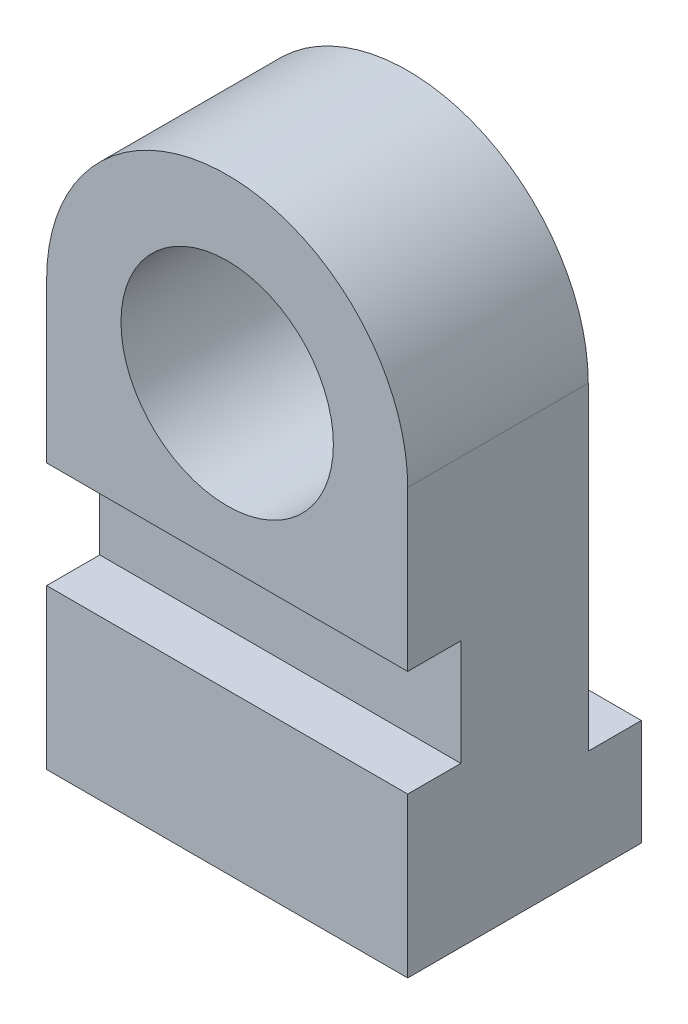
ISO-10303-21;
HEADER;
FILE_DESCRIPTION(('STEP AP214'),'2;1');
FILE_NAME('part.step','',(''),(''),'','','');
FILE_SCHEMA(('AUTOMOTIVE_DESIGN { 1 0 10303 214 1 1 1 1 }'));
ENDSEC;
DATA;
#1=APPLICATION_CONTEXT('core data for automotive mechanical design processes');
#2=APPLICATION_PROTOCOL_DEFINITION('international standard','automotive_design',2000,#1);
#3=PRODUCT_CONTEXT('',#1,'mechanical');
#4=PRODUCT('Part','Part','',(#3));
#5=PRODUCT_RELATED_PRODUCT_CATEGORY('part','',(#4));
#6=PRODUCT_DEFINITION_FORMATION('','',#4);
#7=PRODUCT_DEFINITION_CONTEXT('part definition',#1,'design');
#8=PRODUCT_DEFINITION('design','',#6,#7);
#9=PRODUCT_DEFINITION_SHAPE('','',#8);
#10=(LENGTH_UNIT() NAMED_UNIT(*) SI_UNIT(.MILLI.,.METRE.));
#11=(NAMED_UNIT(*) PLANE_ANGLE_UNIT() SI_UNIT($,.RADIAN.));
#12=(NAMED_UNIT(*) SI_UNIT($,.STERADIAN.) SOLID_ANGLE_UNIT());
#13=UNCERTAINTY_MEASURE_WITH_UNIT(LENGTH_MEASURE(1.E-05),#10,'distance_accuracy_value','');
#14=(GEOMETRIC_REPRESENTATION_CONTEXT(3) GLOBAL_UNCERTAINTY_ASSIGNED_CONTEXT((#13)) GLOBAL_UNIT_ASSIGNED_CONTEXT((#10,
#11,#12)) REPRESENTATION_CONTEXT('',''));
#15=CARTESIAN_POINT('',(0.,0.,0.));
#16=DIRECTION('',(0.,0.,1.));
#17=DIRECTION('',(1.,0.,0.));
#18=AXIS2_PLACEMENT_3D('',#15,#16,#17);
#19=CARTESIAN_POINT('',(-32465.7534246576,40000.,17000.));
#20=DIRECTION('',(0.,0.,-1.));
#21=DIRECTION('',(-1.,0.,0.));
#22=AXIS2_PLACEMENT_3D('',#19,#20,#21);
#23=PLANE('',#22);
#24=CARTESIAN_POINT('',(-32465.7534246576,40000.,17000.));
#25=DIRECTION('',(0.,0.,1.));
#26=DIRECTION('',(1.,0.,0.));
#27=AXIS2_PLACEMENT_3D('',#24,#25,#26);
#28=CIRCLE('',#27,10000.);
#29=CARTESIAN_POINT('',(-22465.7534246576,40000.,17000.));
#30=VERTEX_POINT('',#29);
#31=EDGE_CURVE('E169',#30,#30,#28,.T.);
#32=ORIENTED_EDGE('',*,*,#31,.F.);
#33=EDGE_LOOP('',(#32));
#34=FACE_BOUND('',#33,.T.);
#35=DIRECTION('',(0.,-1.,0.));
#36=VECTOR('',#35,1.);
#37=CARTESIAN_POINT('',(-49465.7534246576,40000.,17000.));
#38=LINE('',#37,#36);
#39=CARTESIAN_POINT('',(-49465.7534246576,40000.,17000.));
#40=VERTEX_POINT('',#39);
#41=CARTESIAN_POINT('',(-49465.7534246576,25000.,17000.));
#42=VERTEX_POINT('',#41);
#43=EDGE_CURVE('E180',#40,#42,#38,.T.);
#44=ORIENTED_EDGE('',*,*,#43,.T.);
#45=DIRECTION('',(-1.,0.,0.));
#46=VECTOR('',#45,1.);
#47=CARTESIAN_POINT('',(-49465.7534246576,25000.,17000.));
#48=LINE('',#47,#46);
#49=CARTESIAN_POINT('',(-15465.7534246576,25000.,17000.));
#50=VERTEX_POINT('',#49);
#51=EDGE_CURVE('E150',#50,#42,#48,.T.);
#52=ORIENTED_EDGE('',*,*,#51,.F.);
#53=DIRECTION('',(0.,1.,0.));
#54=VECTOR('',#53,1.);
#55=CARTESIAN_POINT('',(-15465.7534246576,0.,17000.));
#56=LINE('',#55,#54);
#57=CARTESIAN_POINT('',(-15465.7534246576,40000.,17000.));
#58=VERTEX_POINT('',#57);
#59=EDGE_CURVE('E185',#50,#58,#56,.T.);
#60=ORIENTED_EDGE('',*,*,#59,.T.);
#61=CARTESIAN_POINT('',(-32465.7534246576,40000.,17000.));
#62=DIRECTION('',(0.,0.,1.));
#63=DIRECTION('',(-1.,0.,0.));
#64=AXIS2_PLACEMENT_3D('',#61,#62,#63);
#65=CIRCLE('',#64,17000.);
#66=EDGE_CURVE('E175',#58,#40,#65,.T.);
#67=ORIENTED_EDGE('',*,*,#66,.T.);
#68=EDGE_LOOP('',(#44,#52,#60,#67));
#69=FACE_BOUND('',#68,.T.);
#70=ADVANCED_FACE('F33',(#34,#69),#23,.F.);
#71=CARTESIAN_POINT('',(-15465.7534246576,0.,17000.));
#72=VERTEX_POINT('',#71);
#73=CARTESIAN_POINT('',(-15465.7534246576,15000.,17000.));
#74=VERTEX_POINT('',#73);
#75=EDGE_CURVE('E120',#72,#74,#56,.T.);
#76=ORIENTED_EDGE('',*,*,#75,.T.);
#77=DIRECTION('',(1.,0.,0.));
#78=VECTOR('',#77,1.);
#79=CARTESIAN_POINT('',(-49465.7534246576,15000.,17000.));
#80=LINE('',#79,#78);
#81=CARTESIAN_POINT('',(-49465.7534246576,15000.,17000.));
#82=VERTEX_POINT('',#81);
#83=EDGE_CURVE('E147',#82,#74,#80,.T.);
#84=ORIENTED_EDGE('',*,*,#83,.F.);
#85=CARTESIAN_POINT('',(-49465.7534246576,0.,17000.));
#86=VERTEX_POINT('',#85);
#87=EDGE_CURVE('E178',#82,#86,#38,.T.);
#88=ORIENTED_EDGE('',*,*,#87,.T.);
#89=DIRECTION('',(1.,0.,0.));
#90=VECTOR('',#89,1.);
#91=CARTESIAN_POINT('',(-49465.7534246576,0.,17000.));
#92=LINE('',#91,#90);
#93=EDGE_CURVE('E183',#86,#72,#92,.T.);
#94=ORIENTED_EDGE('',*,*,#93,.T.);
#95=EDGE_LOOP('',(#76,#84,#88,#94));
#96=FACE_BOUND('',#95,.T.);
#97=ADVANCED_FACE('F218',(#96),#23,.F.);
#98=CARTESIAN_POINT('',(-32465.7534246576,40000.,0.));
#99=DIRECTION('',(0.,0.,-1.));
#100=DIRECTION('',(-1.,0.,0.));
#101=AXIS2_PLACEMENT_3D('',#98,#99,#100);
#102=PLANE('',#101);
#103=DIRECTION('',(1.,0.,0.));
#104=VECTOR('',#103,1.);
#105=CARTESIAN_POINT('',(-15465.7534246576,10000.,0.));
#106=LINE('',#105,#104);
#107=CARTESIAN_POINT('',(-49465.7534246576,10000.,0.));
#108=VERTEX_POINT('',#107);
#109=CARTESIAN_POINT('',(-15465.7534246576,10000.,0.));
#110=VERTEX_POINT('',#109);
#111=EDGE_CURVE('E48',#108,#110,#106,.T.);
#112=ORIENTED_EDGE('',*,*,#111,.F.);
#113=DIRECTION('',(0.,-1.,0.));
#114=VECTOR('',#113,1.);
#115=CARTESIAN_POINT('',(-49465.7534246576,40000.,0.));
#116=LINE('',#115,#114);
#117=CARTESIAN_POINT('',(-49465.7534246576,40000.,0.));
#118=VERTEX_POINT('',#117);
#119=EDGE_CURVE('E189',#118,#108,#116,.T.);
#120=ORIENTED_EDGE('',*,*,#119,.F.);
#121=CARTESIAN_POINT('',(-32465.7534246576,40000.,0.));
#122=DIRECTION('',(0.,0.,1.));
#123=DIRECTION('',(-1.,0.,0.));
#124=AXIS2_PLACEMENT_3D('',#121,#122,#123);
#125=CIRCLE('',#124,17000.);
#126=CARTESIAN_POINT('',(-15465.7534246576,40000.,0.));
#127=VERTEX_POINT('',#126);
#128=EDGE_CURVE('E172',#127,#118,#125,.T.);
#129=ORIENTED_EDGE('',*,*,#128,.F.);
#130=DIRECTION('',(0.,1.,0.));
#131=VECTOR('',#130,1.);
#132=CARTESIAN_POINT('',(-15465.7534246576,0.,0.));
#133=LINE('',#132,#131);
#134=EDGE_CURVE('E179',#110,#127,#133,.T.);
#135=ORIENTED_EDGE('',*,*,#134,.F.);
#136=EDGE_LOOP('',(#112,#120,#129,#135));
#137=FACE_BOUND('',#136,.T.);
#138=CARTESIAN_POINT('',(-32465.7534246576,40000.,0.));
#139=DIRECTION('',(0.,0.,1.));
#140=DIRECTION('',(1.,0.,0.));
#141=AXIS2_PLACEMENT_3D('',#138,#139,#140);
#142=CIRCLE('',#141,10000.);
#143=CARTESIAN_POINT('',(-22465.7534246576,40000.,0.));
#144=VERTEX_POINT('',#143);
#145=EDGE_CURVE('E163',#144,#144,#142,.T.);
#146=ORIENTED_EDGE('',*,*,#145,.T.);
#147=EDGE_LOOP('',(#146));
#148=FACE_BOUND('',#147,.T.);
#149=ADVANCED_FACE('F198',(#137,#148),#102,.T.);
#150=CARTESIAN_POINT('',(-32465.7534246576,40000.,17000.));
#151=DIRECTION('',(0.,0.,-1.));
#152=DIRECTION('',(-1.,0.,0.));
#153=AXIS2_PLACEMENT_3D('',#150,#151,#152);
#154=CYLINDRICAL_SURFACE('',#153,17000.);
#155=ORIENTED_EDGE('',*,*,#128,.T.);
#156=DIRECTION('',(0.,0.,-1.));
#157=VECTOR('',#156,1.);
#158=CARTESIAN_POINT('',(-49465.7534246576,40000.,17000.));
#159=LINE('',#158,#157);
#160=EDGE_CURVE('E11',#40,#118,#159,.T.);
#161=ORIENTED_EDGE('',*,*,#160,.F.);
#162=ORIENTED_EDGE('',*,*,#66,.F.);
#163=DIRECTION('',(0.,0.,-1.));
#164=VECTOR('',#163,1.);
#165=CARTESIAN_POINT('',(-15465.7534246576,40000.,17000.));
#166=LINE('',#165,#164);
#167=EDGE_CURVE('E123',#58,#127,#166,.T.);
#168=ORIENTED_EDGE('',*,*,#167,.T.);
#169=EDGE_LOOP('',(#155,#161,#162,#168));
#170=FACE_BOUND('',#169,.T.);
#171=ADVANCED_FACE('F35',(#170),#154,.T.);
#172=CARTESIAN_POINT('',(-49465.7534246576,40000.,17000.));
#173=DIRECTION('',(1.,0.,0.));
#174=DIRECTION('',(0.,0.,-1.));
#175=AXIS2_PLACEMENT_3D('',#172,#173,#174);
#176=PLANE('',#175);
#177=DIRECTION('',(0.,-1.,0.));
#178=VECTOR('',#177,1.);
#179=CARTESIAN_POINT('',(-49465.7534246576,25000.,12000.));
#180=LINE('',#179,#178);
#181=CARTESIAN_POINT('',(-49465.7534246576,25000.,12000.));
#182=VERTEX_POINT('',#181);
#183=CARTESIAN_POINT('',(-49465.7534246576,15000.,12000.));
#184=VERTEX_POINT('',#183);
#185=EDGE_CURVE('E148',#182,#184,#180,.T.);
#186=ORIENTED_EDGE('',*,*,#185,.F.);
#187=DIRECTION('',(0.,0.,1.));
#188=VECTOR('',#187,1.);
#189=CARTESIAN_POINT('',(-49465.7534246576,25000.,12000.));
#190=LINE('',#189,#188);
#191=EDGE_CURVE('E160',#182,#42,#190,.T.);
#192=ORIENTED_EDGE('',*,*,#191,.T.);
#193=ORIENTED_EDGE('',*,*,#43,.F.);
#194=ORIENTED_EDGE('',*,*,#160,.T.);
#195=ORIENTED_EDGE('',*,*,#119,.T.);
#196=DIRECTION('',(0.,0.,1.));
#197=VECTOR('',#196,1.);
#198=CARTESIAN_POINT('',(-49465.7534246576,10000.,-5000.));
#199=LINE('',#198,#197);
#200=CARTESIAN_POINT('',(-49465.7534246576,10000.,-5000.));
#201=VERTEX_POINT('',#200);
#202=EDGE_CURVE('E144',#201,#108,#199,.T.);
#203=ORIENTED_EDGE('',*,*,#202,.F.);
#204=DIRECTION('',(0.,1.,0.));
#205=VECTOR('',#204,1.);
#206=CARTESIAN_POINT('',(-49465.7534246576,0.,-5000.));
#207=LINE('',#206,#205);
#208=CARTESIAN_POINT('',(-49465.7534246576,0.,-5000.));
#209=VERTEX_POINT('',#208);
#210=EDGE_CURVE('E131',#209,#201,#207,.T.);
#211=ORIENTED_EDGE('',*,*,#210,.F.);
#212=DIRECTION('',(0.,0.,-1.));
#213=VECTOR('',#212,1.);
#214=CARTESIAN_POINT('',(-49465.7534246576,0.,17000.));
#215=LINE('',#214,#213);
#216=EDGE_CURVE('E41',#86,#209,#215,.T.);
#217=ORIENTED_EDGE('',*,*,#216,.F.);
#218=ORIENTED_EDGE('',*,*,#87,.F.);
#219=DIRECTION('',(0.,0.,1.));
#220=VECTOR('',#219,1.);
#221=CARTESIAN_POINT('',(-49465.7534246576,15000.,12000.));
#222=LINE('',#221,#220);
#223=EDGE_CURVE('E157',#184,#82,#222,.T.);
#224=ORIENTED_EDGE('',*,*,#223,.F.);
#225=EDGE_LOOP('',(#186,#192,#193,#194,#195,#203,#211,#217,#218,#224));
#226=FACE_BOUND('',#225,.T.);
#227=ADVANCED_FACE('F203',(#226),#176,.F.);
#228=CARTESIAN_POINT('',(-49465.7534246576,0.,17000.));
#229=DIRECTION('',(0.,1.,0.));
#230=DIRECTION('',(0.,0.,1.));
#231=AXIS2_PLACEMENT_3D('',#228,#229,#230);
#232=PLANE('',#231);
#233=ORIENTED_EDGE('',*,*,#216,.T.);
#234=DIRECTION('',(-1.,0.,0.));
#235=VECTOR('',#234,1.);
#236=CARTESIAN_POINT('',(-15465.7534246576,0.,-5000.));
#237=LINE('',#236,#235);
#238=CARTESIAN_POINT('',(-15465.7534246576,0.,-5000.));
#239=VERTEX_POINT('',#238);
#240=EDGE_CURVE('E126',#239,#209,#237,.T.);
#241=ORIENTED_EDGE('',*,*,#240,.F.);
#242=DIRECTION('',(0.,0.,-1.));
#243=VECTOR('',#242,1.);
#244=CARTESIAN_POINT('',(-15465.7534246576,0.,17000.));
#245=LINE('',#244,#243);
#246=EDGE_CURVE('E111',#72,#239,#245,.T.);
#247=ORIENTED_EDGE('',*,*,#246,.F.);
#248=ORIENTED_EDGE('',*,*,#93,.F.);
#249=EDGE_LOOP('',(#233,#241,#247,#248));
#250=FACE_BOUND('',#249,.T.);
#251=ADVANCED_FACE('F127',(#250),#232,.F.);
#252=CARTESIAN_POINT('',(-15465.7534246576,0.,17000.));
#253=DIRECTION('',(-1.,0.,0.));
#254=DIRECTION('',(0.,0.,1.));
#255=AXIS2_PLACEMENT_3D('',#252,#253,#254);
#256=PLANE('',#255);
#257=ORIENTED_EDGE('',*,*,#59,.F.);
#258=DIRECTION('',(0.,0.,1.));
#259=VECTOR('',#258,1.);
#260=CARTESIAN_POINT('',(-15465.7534246576,25000.,12000.));
#261=LINE('',#260,#259);
#262=CARTESIAN_POINT('',(-15465.7534246576,25000.,12000.));
#263=VERTEX_POINT('',#262);
#264=EDGE_CURVE('E164',#263,#50,#261,.T.);
#265=ORIENTED_EDGE('',*,*,#264,.F.);
#266=DIRECTION('',(0.,1.,0.));
#267=VECTOR('',#266,1.);
#268=CARTESIAN_POINT('',(-15465.7534246576,25000.,12000.));
#269=LINE('',#268,#267);
#270=CARTESIAN_POINT('',(-15465.7534246576,15000.,12000.));
#271=VERTEX_POINT('',#270);
#272=EDGE_CURVE('E152',#271,#263,#269,.T.);
#273=ORIENTED_EDGE('',*,*,#272,.F.);
#274=DIRECTION('',(0.,0.,1.));
#275=VECTOR('',#274,1.);
#276=CARTESIAN_POINT('',(-15465.7534246576,15000.,12000.));
#277=LINE('',#276,#275);
#278=EDGE_CURVE('E166',#271,#74,#277,.T.);
#279=ORIENTED_EDGE('',*,*,#278,.T.);
#280=ORIENTED_EDGE('',*,*,#75,.F.);
#281=ORIENTED_EDGE('',*,*,#246,.T.);
#282=DIRECTION('',(0.,-1.,0.));
#283=VECTOR('',#282,1.);
#284=CARTESIAN_POINT('',(-15465.7534246576,0.,-5000.));
#285=LINE('',#284,#283);
#286=CARTESIAN_POINT('',(-15465.7534246576,10000.,-5000.));
#287=VERTEX_POINT('',#286);
#288=EDGE_CURVE('E117',#287,#239,#285,.T.);
#289=ORIENTED_EDGE('',*,*,#288,.F.);
#290=DIRECTION('',(0.,0.,1.));
#291=VECTOR('',#290,1.);
#292=CARTESIAN_POINT('',(-15465.7534246576,10000.,-5000.));
#293=LINE('',#292,#291);
#294=EDGE_CURVE('E141',#287,#110,#293,.T.);
#295=ORIENTED_EDGE('',*,*,#294,.T.);
#296=ORIENTED_EDGE('',*,*,#134,.T.);
#297=ORIENTED_EDGE('',*,*,#167,.F.);
#298=EDGE_LOOP('',(#257,#265,#273,#279,#280,#281,#289,#295,#296,#297));
#299=FACE_BOUND('',#298,.T.);
#300=ADVANCED_FACE('F114',(#299),#256,.F.);
#301=CARTESIAN_POINT('',(-32465.7534246576,40000.,17000.));
#302=DIRECTION('',(0.,0.,-1.));
#303=DIRECTION('',(-1.,0.,0.));
#304=AXIS2_PLACEMENT_3D('',#301,#302,#303);
#305=CYLINDRICAL_SURFACE('',#304,10000.);
#306=ORIENTED_EDGE('',*,*,#31,.T.);
#307=EDGE_LOOP('',(#306));
#308=FACE_BOUND('',#307,.T.);
#309=ORIENTED_EDGE('',*,*,#145,.F.);
#310=EDGE_LOOP('',(#309));
#311=FACE_BOUND('',#310,.T.);
#312=ADVANCED_FACE('F238',(#308,#311),#305,.F.);
#313=CARTESIAN_POINT('',(-49465.7534246576,25000.,12000.));
#314=DIRECTION('',(0.,1.,0.));
#315=DIRECTION('',(0.,0.,1.));
#316=AXIS2_PLACEMENT_3D('',#313,#314,#315);
#317=PLANE('',#316);
#318=ORIENTED_EDGE('',*,*,#51,.T.);
#319=ORIENTED_EDGE('',*,*,#191,.F.);
#320=DIRECTION('',(-1.,0.,0.));
#321=VECTOR('',#320,1.);
#322=CARTESIAN_POINT('',(-49465.7534246576,25000.,12000.));
#323=LINE('',#322,#321);
#324=EDGE_CURVE('E154',#263,#182,#323,.T.);
#325=ORIENTED_EDGE('',*,*,#324,.F.);
#326=ORIENTED_EDGE('',*,*,#264,.T.);
#327=EDGE_LOOP('',(#318,#319,#325,#326));
#328=FACE_BOUND('',#327,.T.);
#329=ADVANCED_FACE('F210',(#328),#317,.F.);
#330=CARTESIAN_POINT('',(-49465.7534246576,15000.,12000.));
#331=DIRECTION('',(0.,-1.,0.));
#332=DIRECTION('',(0.,0.,-1.));
#333=AXIS2_PLACEMENT_3D('',#330,#331,#332);
#334=PLANE('',#333);
#335=ORIENTED_EDGE('',*,*,#83,.T.);
#336=ORIENTED_EDGE('',*,*,#278,.F.);
#337=DIRECTION('',(1.,0.,0.));
#338=VECTOR('',#337,1.);
#339=CARTESIAN_POINT('',(-49465.7534246576,15000.,12000.));
#340=LINE('',#339,#338);
#341=EDGE_CURVE('E56',#184,#271,#340,.T.);
#342=ORIENTED_EDGE('',*,*,#341,.F.);
#343=ORIENTED_EDGE('',*,*,#223,.T.);
#344=EDGE_LOOP('',(#335,#336,#342,#343));
#345=FACE_BOUND('',#344,.T.);
#346=ADVANCED_FACE('F216',(#345),#334,.F.);
#347=CARTESIAN_POINT('',(0.,0.,12000.));
#348=DIRECTION('',(0.,0.,1.));
#349=DIRECTION('',(1.,0.,0.));
#350=AXIS2_PLACEMENT_3D('',#347,#348,#349);
#351=PLANE('',#350);
#352=ORIENTED_EDGE('',*,*,#185,.T.);
#353=ORIENTED_EDGE('',*,*,#341,.T.);
#354=ORIENTED_EDGE('',*,*,#272,.T.);
#355=ORIENTED_EDGE('',*,*,#324,.T.);
#356=EDGE_LOOP('',(#352,#353,#354,#355));
#357=FACE_BOUND('',#356,.T.);
#358=ADVANCED_FACE('F211',(#357),#351,.T.);
#359=CARTESIAN_POINT('',(-15465.7534246576,10000.,-5000.));
#360=DIRECTION('',(0.,-1.,0.));
#361=DIRECTION('',(0.,0.,-1.));
#362=AXIS2_PLACEMENT_3D('',#359,#360,#361);
#363=PLANE('',#362);
#364=ORIENTED_EDGE('',*,*,#111,.T.);
#365=ORIENTED_EDGE('',*,*,#294,.F.);
#366=DIRECTION('',(1.,0.,0.));
#367=VECTOR('',#366,1.);
#368=CARTESIAN_POINT('',(-15465.7534246576,10000.,-5000.));
#369=LINE('',#368,#367);
#370=EDGE_CURVE('E135',#201,#287,#369,.T.);
#371=ORIENTED_EDGE('',*,*,#370,.F.);
#372=ORIENTED_EDGE('',*,*,#202,.T.);
#373=EDGE_LOOP('',(#364,#365,#371,#372));
#374=FACE_BOUND('',#373,.T.);
#375=ADVANCED_FACE('F220',(#374),#363,.F.);
#376=CARTESIAN_POINT('',(0.,0.,-5000.));
#377=DIRECTION('',(0.,0.,1.));
#378=DIRECTION('',(1.,0.,0.));
#379=AXIS2_PLACEMENT_3D('',#376,#377,#378);
#380=PLANE('',#379);
#381=ORIENTED_EDGE('',*,*,#288,.T.);
#382=ORIENTED_EDGE('',*,*,#240,.T.);
#383=ORIENTED_EDGE('',*,*,#210,.T.);
#384=ORIENTED_EDGE('',*,*,#370,.T.);
#385=EDGE_LOOP('',(#381,#382,#383,#384));
#386=FACE_BOUND('',#385,.T.);
#387=ADVANCED_FACE('F133',(#386),#380,.F.);
#388=CLOSED_SHELL('',(#70,#97,#149,#171,#227,#251,#300,#312,#329,#346,#358,#375,#387));
#389=MANIFOLD_SOLID_BREP('B2',#388);
#390=ADVANCED_BREP_SHAPE_REPRESENTATION('',(#18,#389),#14);
#391=SHAPE_DEFINITION_REPRESENTATION(#9,#390);
ENDSEC;
END-ISO-10303-21;
